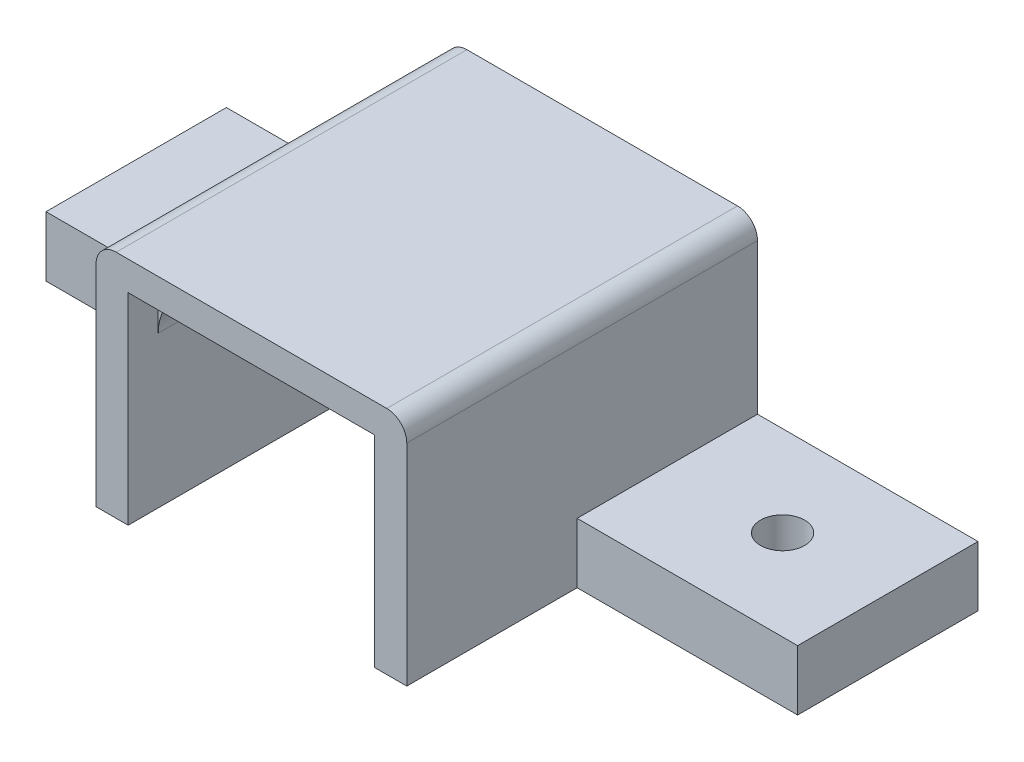
ISO-10303-21;
HEADER;
FILE_DESCRIPTION(('STEP AP214'),'2;1');
FILE_NAME('part.step','',(''),(''),'','','');
FILE_SCHEMA(('AUTOMOTIVE_DESIGN { 1 0 10303 214 1 1 1 1 }'));
ENDSEC;
DATA;
#1=APPLICATION_CONTEXT('core data for automotive mechanical design processes');
#2=APPLICATION_PROTOCOL_DEFINITION('international standard','automotive_design',2000,#1);
#3=PRODUCT_CONTEXT('',#1,'mechanical');
#4=PRODUCT('Part','Part','',(#3));
#5=PRODUCT_RELATED_PRODUCT_CATEGORY('part','',(#4));
#6=PRODUCT_DEFINITION_FORMATION('','',#4);
#7=PRODUCT_DEFINITION_CONTEXT('part definition',#1,'design');
#8=PRODUCT_DEFINITION('design','',#6,#7);
#9=PRODUCT_DEFINITION_SHAPE('','',#8);
#10=(LENGTH_UNIT() NAMED_UNIT(*) SI_UNIT(.MILLI.,.METRE.));
#11=(NAMED_UNIT(*) PLANE_ANGLE_UNIT() SI_UNIT($,.RADIAN.));
#12=(NAMED_UNIT(*) SI_UNIT($,.STERADIAN.) SOLID_ANGLE_UNIT());
#13=UNCERTAINTY_MEASURE_WITH_UNIT(LENGTH_MEASURE(1.E-05),#10,'distance_accuracy_value','');
#14=(GEOMETRIC_REPRESENTATION_CONTEXT(3) GLOBAL_UNCERTAINTY_ASSIGNED_CONTEXT((#13)) GLOBAL_UNIT_ASSIGNED_CONTEXT((#10,
#11,#12)) REPRESENTATION_CONTEXT('',''));
#15=CARTESIAN_POINT('',(0.,0.,0.));
#16=DIRECTION('',(0.,0.,1.));
#17=DIRECTION('',(1.,0.,0.));
#18=AXIS2_PLACEMENT_3D('',#15,#16,#17);
#19=CARTESIAN_POINT('',(0.,10.05,-8.75));
#20=DIRECTION('',(0.,-1.,0.));
#21=DIRECTION('',(0.,0.,-1.));
#22=AXIS2_PLACEMENT_3D('',#19,#20,#21);
#23=PLANE('',#22);
#24=DIRECTION('',(0.,0.,1.));
#25=VECTOR('',#24,1.);
#26=CARTESIAN_POINT('',(6.15,10.05,0.));
#27=LINE('',#26,#25);
#28=CARTESIAN_POINT('',(6.15,10.05,-0.750000000000001));
#29=VERTEX_POINT('',#28);
#30=CARTESIAN_POINT('',(6.15,10.05,3.25));
#31=VERTEX_POINT('',#30);
#32=EDGE_CURVE('E248',#29,#31,#27,.T.);
#33=ORIENTED_EDGE('',*,*,#32,.T.);
#34=DIRECTION('',(1.,0.,0.));
#35=VECTOR('',#34,1.);
#36=CARTESIAN_POINT('',(0.,10.05,3.25));
#37=LINE('',#36,#35);
#38=CARTESIAN_POINT('',(4.15,10.05,3.25));
#39=VERTEX_POINT('',#38);
#40=EDGE_CURVE('E234',#39,#31,#37,.T.);
#41=ORIENTED_EDGE('',*,*,#40,.F.);
#42=DIRECTION('',(0.,0.,1.));
#43=VECTOR('',#42,1.);
#44=CARTESIAN_POINT('',(4.15,10.05,-8.75));
#45=LINE('',#44,#43);
#46=CARTESIAN_POINT('',(4.15,10.05,7.25));
#47=VERTEX_POINT('',#46);
#48=EDGE_CURVE('E394',#39,#47,#45,.T.);
#49=ORIENTED_EDGE('',*,*,#48,.T.);
#50=DIRECTION('',(1.,0.,0.));
#51=VECTOR('',#50,1.);
#52=CARTESIAN_POINT('',(0.,10.05,7.25));
#53=LINE('',#52,#51);
#54=CARTESIAN_POINT('',(6.15,10.05,7.25));
#55=VERTEX_POINT('',#54);
#56=EDGE_CURVE('E237',#47,#55,#53,.T.);
#57=ORIENTED_EDGE('',*,*,#56,.T.);
#58=DIRECTION('',(0.,0.,1.));
#59=VECTOR('',#58,1.);
#60=CARTESIAN_POINT('',(6.15,10.05,0.));
#61=LINE('',#60,#59);
#62=CARTESIAN_POINT('',(6.15,10.05,8.75));
#63=VERTEX_POINT('',#62);
#64=EDGE_CURVE('E240',#55,#63,#61,.T.);
#65=ORIENTED_EDGE('',*,*,#64,.T.);
#66=DIRECTION('',(1.,0.,0.));
#67=VECTOR('',#66,1.);
#68=CARTESIAN_POINT('',(0.,10.05,8.75));
#69=LINE('',#68,#67);
#70=CARTESIAN_POINT('',(-6.15,10.05,8.75));
#71=VERTEX_POINT('',#70);
#72=EDGE_CURVE('E357',#71,#63,#69,.T.);
#73=ORIENTED_EDGE('',*,*,#72,.F.);
#74=DIRECTION('',(0.,0.,-1.));
#75=VECTOR('',#74,1.);
#76=CARTESIAN_POINT('',(-6.15,10.05,0.));
#77=LINE('',#76,#75);
#78=CARTESIAN_POINT('',(-6.15,10.05,7.25));
#79=VERTEX_POINT('',#78);
#80=EDGE_CURVE('E243',#71,#79,#77,.T.);
#81=ORIENTED_EDGE('',*,*,#80,.T.);
#82=DIRECTION('',(-1.,0.,0.));
#83=VECTOR('',#82,1.);
#84=CARTESIAN_POINT('',(-6.15,10.05,7.25));
#85=LINE('',#84,#83);
#86=CARTESIAN_POINT('',(-3.65,10.05,7.25));
#87=VERTEX_POINT('',#86);
#88=EDGE_CURVE('E214',#87,#79,#85,.T.);
#89=ORIENTED_EDGE('',*,*,#88,.F.);
#90=DIRECTION('',(0.,0.,1.));
#91=VECTOR('',#90,1.);
#92=CARTESIAN_POINT('',(-3.65,10.05,7.25));
#93=LINE('',#92,#91);
#94=CARTESIAN_POINT('',(-3.65,10.05,3.25));
#95=VERTEX_POINT('',#94);
#96=EDGE_CURVE('E503',#95,#87,#93,.T.);
#97=ORIENTED_EDGE('',*,*,#96,.F.);
#98=DIRECTION('',(1.,0.,0.));
#99=VECTOR('',#98,1.);
#100=CARTESIAN_POINT('',(-6.15,10.05,3.25));
#101=LINE('',#100,#99);
#102=CARTESIAN_POINT('',(-6.15,10.05,3.25));
#103=VERTEX_POINT('',#102);
#104=EDGE_CURVE('E220',#103,#95,#101,.T.);
#105=ORIENTED_EDGE('',*,*,#104,.F.);
#106=CARTESIAN_POINT('',(-6.15,10.05,-0.750000000000001));
#107=VERTEX_POINT('',#106);
#108=EDGE_CURVE('E226',#103,#107,#77,.T.);
#109=ORIENTED_EDGE('',*,*,#108,.T.);
#110=DIRECTION('',(1.,0.,0.));
#111=VECTOR('',#110,1.);
#112=CARTESIAN_POINT('',(0.,10.05,-0.750000000000001));
#113=LINE('',#112,#111);
#114=CARTESIAN_POINT('',(-4.15,10.05,-0.750000000000001));
#115=VERTEX_POINT('',#114);
#116=EDGE_CURVE('E58',#107,#115,#113,.T.);
#117=ORIENTED_EDGE('',*,*,#116,.T.);
#118=DIRECTION('',(0.,0.,1.));
#119=VECTOR('',#118,1.);
#120=CARTESIAN_POINT('',(-4.15,10.05,-8.75));
#121=LINE('',#120,#119);
#122=CARTESIAN_POINT('',(-4.15,10.05,-8.75));
#123=VERTEX_POINT('',#122);
#124=EDGE_CURVE('E398',#115,#123,#121,.F.);
#125=ORIENTED_EDGE('',*,*,#124,.T.);
#126=DIRECTION('',(1.,0.,0.));
#127=VECTOR('',#126,1.);
#128=CARTESIAN_POINT('',(0.,10.05,-8.75));
#129=LINE('',#128,#127);
#130=CARTESIAN_POINT('',(4.15,10.05,-8.75));
#131=VERTEX_POINT('',#130);
#132=EDGE_CURVE('E356',#123,#131,#129,.T.);
#133=ORIENTED_EDGE('',*,*,#132,.T.);
#134=CARTESIAN_POINT('',(4.15,10.05,-0.750000000000001));
#135=VERTEX_POINT('',#134);
#136=EDGE_CURVE('E395',#131,#135,#45,.T.);
#137=ORIENTED_EDGE('',*,*,#136,.T.);
#138=EDGE_CURVE('E246',#135,#29,#113,.T.);
#139=ORIENTED_EDGE('',*,*,#138,.T.);
#140=EDGE_LOOP('',(#33,#41,#49,#57,#65,#73,#81,#89,#97,#105,#109,#117,#125,#133,#137,#139));
#141=FACE_BOUND('',#140,.T.);
#142=ADVANCED_FACE('F35',(#141),#23,.T.);
#143=CARTESIAN_POINT('',(-6.15,0.,-8.75));
#144=DIRECTION('',(-1.,0.,0.));
#145=DIRECTION('',(0.,1.,0.));
#146=AXIS2_PLACEMENT_3D('',#143,#144,#145);
#147=PLANE('',#146);
#148=DIRECTION('',(0.,1.,0.));
#149=VECTOR('',#148,1.);
#150=CARTESIAN_POINT('',(-6.15,7.55,3.25));
#151=LINE('',#150,#149);
#152=CARTESIAN_POINT('',(-6.15,7.55,3.25));
#153=VERTEX_POINT('',#152);
#154=EDGE_CURVE('E218',#153,#103,#151,.T.);
#155=ORIENTED_EDGE('',*,*,#154,.F.);
#156=DIRECTION('',(0.,0.,-1.));
#157=VECTOR('',#156,1.);
#158=CARTESIAN_POINT('',(-6.15,7.55,7.25));
#159=LINE('',#158,#157);
#160=CARTESIAN_POINT('',(-6.15,7.55,7.25));
#161=VERTEX_POINT('',#160);
#162=EDGE_CURVE('E205',#161,#153,#159,.T.);
#163=ORIENTED_EDGE('',*,*,#162,.F.);
#164=DIRECTION('',(0.,1.,0.));
#165=VECTOR('',#164,1.);
#166=CARTESIAN_POINT('',(-6.15,7.55,7.25));
#167=LINE('',#166,#165);
#168=EDGE_CURVE('E213',#161,#79,#167,.T.);
#169=ORIENTED_EDGE('',*,*,#168,.T.);
#170=ORIENTED_EDGE('',*,*,#80,.F.);
#171=DIRECTION('',(0.,1.,0.));
#172=VECTOR('',#171,1.);
#173=CARTESIAN_POINT('',(-6.15,0.,8.75));
#174=LINE('',#173,#172);
#175=CARTESIAN_POINT('',(-6.15,0.,8.75));
#176=VERTEX_POINT('',#175);
#177=EDGE_CURVE('E321',#176,#71,#174,.T.);
#178=ORIENTED_EDGE('',*,*,#177,.F.);
#179=DIRECTION('',(0.,0.,1.));
#180=VECTOR('',#179,1.);
#181=CARTESIAN_POINT('',(-6.15,0.,-8.75));
#182=LINE('',#181,#180);
#183=CARTESIAN_POINT('',(-6.15,0.,-8.75));
#184=VERTEX_POINT('',#183);
#185=EDGE_CURVE('E326',#184,#176,#182,.T.);
#186=ORIENTED_EDGE('',*,*,#185,.F.);
#187=DIRECTION('',(0.,1.,0.));
#188=VECTOR('',#187,1.);
#189=CARTESIAN_POINT('',(-6.15,0.,-8.75));
#190=LINE('',#189,#188);
#191=CARTESIAN_POINT('',(-6.15,8.05,-8.75));
#192=VERTEX_POINT('',#191);
#193=EDGE_CURVE('E323',#184,#192,#190,.T.);
#194=ORIENTED_EDGE('',*,*,#193,.T.);
#195=DIRECTION('',(0.,0.,1.));
#196=VECTOR('',#195,1.);
#197=CARTESIAN_POINT('',(-6.15,8.05,-8.75));
#198=LINE('',#197,#196);
#199=CARTESIAN_POINT('',(-6.15,8.05,-0.750000000000001));
#200=VERTEX_POINT('',#199);
#201=EDGE_CURVE('E391',#192,#200,#198,.T.);
#202=ORIENTED_EDGE('',*,*,#201,.T.);
#203=DIRECTION('',(0.,-1.,0.));
#204=VECTOR('',#203,1.);
#205=CARTESIAN_POINT('',(-6.15,25.5915571935376,-0.750000000000001));
#206=LINE('',#205,#204);
#207=EDGE_CURVE('E253',#107,#200,#206,.T.);
#208=ORIENTED_EDGE('',*,*,#207,.F.);
#209=ORIENTED_EDGE('',*,*,#108,.F.);
#210=EDGE_LOOP('',(#155,#163,#169,#170,#178,#186,#194,#202,#208,#209));
#211=FACE_BOUND('',#210,.T.);
#212=ADVANCED_FACE('F224',(#211),#147,.F.);
#213=CARTESIAN_POINT('',(-7.75,11.5,8.75));
#214=DIRECTION('',(0.,0.,-1.));
#215=DIRECTION('',(-1.,0.,0.));
#216=AXIS2_PLACEMENT_3D('',#213,#214,#215);
#217=PLANE('',#216);
#218=ORIENTED_EDGE('',*,*,#72,.T.);
#219=DIRECTION('',(0.,1.,0.));
#220=VECTOR('',#219,1.);
#221=CARTESIAN_POINT('',(6.15,0.,8.75));
#222=LINE('',#221,#220);
#223=CARTESIAN_POINT('',(6.15,0.,8.75));
#224=VERTEX_POINT('',#223);
#225=EDGE_CURVE('E352',#224,#63,#222,.T.);
#226=ORIENTED_EDGE('',*,*,#225,.F.);
#227=DIRECTION('',(1.,0.,0.));
#228=VECTOR('',#227,1.);
#229=CARTESIAN_POINT('',(-7.75,0.,8.75));
#230=LINE('',#229,#228);
#231=CARTESIAN_POINT('',(7.75,0.,8.75));
#232=VERTEX_POINT('',#231);
#233=EDGE_CURVE('E369',#224,#232,#230,.T.);
#234=ORIENTED_EDGE('',*,*,#233,.T.);
#235=DIRECTION('',(0.,-1.,0.));
#236=VECTOR('',#235,1.);
#237=CARTESIAN_POINT('',(7.75,11.5,8.75));
#238=LINE('',#237,#236);
#239=CARTESIAN_POINT('',(7.75,10.5,8.75));
#240=VERTEX_POINT('',#239);
#241=EDGE_CURVE('E377',#240,#232,#238,.T.);
#242=ORIENTED_EDGE('',*,*,#241,.F.);
#243=CARTESIAN_POINT('',(6.75,10.5,8.75));
#244=DIRECTION('',(0.,0.,-1.));
#245=DIRECTION('',(-1.,0.,0.));
#246=AXIS2_PLACEMENT_3D('',#243,#244,#245);
#247=CIRCLE('',#246,1.);
#248=CARTESIAN_POINT('',(6.75,11.5,8.75));
#249=VERTEX_POINT('',#248);
#250=EDGE_CURVE('E388',#240,#249,#247,.F.);
#251=ORIENTED_EDGE('',*,*,#250,.T.);
#252=DIRECTION('',(1.,0.,0.));
#253=VECTOR('',#252,1.);
#254=CARTESIAN_POINT('',(-7.75,11.5,8.75));
#255=LINE('',#254,#253);
#256=CARTESIAN_POINT('',(-6.75,11.5,8.75));
#257=VERTEX_POINT('',#256);
#258=EDGE_CURVE('E368',#257,#249,#255,.T.);
#259=ORIENTED_EDGE('',*,*,#258,.F.);
#260=CARTESIAN_POINT('',(-6.75,10.5,8.75));
#261=DIRECTION('',(0.,0.,1.));
#262=DIRECTION('',(1.,0.,0.));
#263=AXIS2_PLACEMENT_3D('',#260,#261,#262);
#264=CIRCLE('',#263,1.);
#265=CARTESIAN_POINT('',(-7.75,10.5,8.75));
#266=VERTEX_POINT('',#265);
#267=EDGE_CURVE('E333',#266,#257,#264,.F.);
#268=ORIENTED_EDGE('',*,*,#267,.F.);
#269=DIRECTION('',(0.,-1.,0.));
#270=VECTOR('',#269,1.);
#271=CARTESIAN_POINT('',(-7.75,11.5,8.75));
#272=LINE('',#271,#270);
#273=CARTESIAN_POINT('',(-7.75,0.,8.75));
#274=VERTEX_POINT('',#273);
#275=EDGE_CURVE('E330',#266,#274,#272,.T.);
#276=ORIENTED_EDGE('',*,*,#275,.T.);
#277=DIRECTION('',(-1.,0.,0.));
#278=VECTOR('',#277,1.);
#279=CARTESIAN_POINT('',(7.75,0.,8.75));
#280=LINE('',#279,#278);
#281=EDGE_CURVE('E328',#176,#274,#280,.T.);
#282=ORIENTED_EDGE('',*,*,#281,.F.);
#283=ORIENTED_EDGE('',*,*,#177,.T.);
#284=EDGE_LOOP('',(#218,#226,#234,#242,#251,#259,#268,#276,#282,#283));
#285=FACE_BOUND('',#284,.T.);
#286=ADVANCED_FACE('F477',(#285),#217,.F.);
#287=CARTESIAN_POINT('',(-4.15,8.05,-8.75));
#288=DIRECTION('',(0.,0.,1.));
#289=DIRECTION('',(1.,0.,0.));
#290=AXIS2_PLACEMENT_3D('',#287,#288,#289);
#291=CYLINDRICAL_SURFACE('',#290,2.);
#292=CARTESIAN_POINT('',(-4.15,8.05,-0.750000000000001));
#293=DIRECTION('',(0.,0.,1.));
#294=DIRECTION('',(1.,0.,0.));
#295=AXIS2_PLACEMENT_3D('',#292,#293,#294);
#296=CIRCLE('',#295,2.);
#297=EDGE_CURVE('E250',#200,#115,#296,.F.);
#298=ORIENTED_EDGE('',*,*,#297,.F.);
#299=ORIENTED_EDGE('',*,*,#201,.F.);
#300=CARTESIAN_POINT('',(-4.15,8.05,-8.75));
#301=DIRECTION('',(0.,0.,-1.));
#302=DIRECTION('',(-1.,0.,0.));
#303=AXIS2_PLACEMENT_3D('',#300,#301,#302);
#304=CIRCLE('',#303,2.);
#305=EDGE_CURVE('E403',#123,#192,#304,.F.);
#306=ORIENTED_EDGE('',*,*,#305,.F.);
#307=ORIENTED_EDGE('',*,*,#124,.F.);
#308=EDGE_LOOP('',(#298,#299,#306,#307));
#309=FACE_BOUND('',#308,.T.);
#310=ADVANCED_FACE('F443',(#309),#291,.F.);
#311=CARTESIAN_POINT('',(4.15,8.05,-8.75));
#312=DIRECTION('',(0.,0.,1.));
#313=DIRECTION('',(1.,0.,0.));
#314=AXIS2_PLACEMENT_3D('',#311,#312,#313);
#315=CYLINDRICAL_SURFACE('',#314,2.);
#316=CARTESIAN_POINT('',(4.15,8.05,-0.750000000000001));
#317=DIRECTION('',(0.,0.,1.));
#318=DIRECTION('',(1.,0.,0.));
#319=AXIS2_PLACEMENT_3D('',#316,#317,#318);
#320=CIRCLE('',#319,2.);
#321=CARTESIAN_POINT('',(6.15,8.05,-0.750000000000001));
#322=VERTEX_POINT('',#321);
#323=EDGE_CURVE('E11',#135,#322,#320,.F.);
#324=ORIENTED_EDGE('',*,*,#323,.F.);
#325=ORIENTED_EDGE('',*,*,#136,.F.);
#326=CARTESIAN_POINT('',(4.15,8.05,-8.75));
#327=DIRECTION('',(0.,0.,-1.));
#328=DIRECTION('',(-1.,0.,0.));
#329=AXIS2_PLACEMENT_3D('',#326,#327,#328);
#330=CIRCLE('',#329,2.);
#331=CARTESIAN_POINT('',(6.15,8.05,-8.75));
#332=VERTEX_POINT('',#331);
#333=EDGE_CURVE('E405',#332,#131,#330,.F.);
#334=ORIENTED_EDGE('',*,*,#333,.F.);
#335=DIRECTION('',(0.,0.,1.));
#336=VECTOR('',#335,1.);
#337=CARTESIAN_POINT('',(6.15,8.05,-8.75));
#338=LINE('',#337,#336);
#339=EDGE_CURVE('E400',#322,#332,#338,.F.);
#340=ORIENTED_EDGE('',*,*,#339,.F.);
#341=EDGE_LOOP('',(#324,#325,#334,#340));
#342=FACE_BOUND('',#341,.T.);
#343=ADVANCED_FACE('F37',(#342),#315,.F.);
#344=CARTESIAN_POINT('',(4.15,8.05,7.25));
#345=DIRECTION('',(0.,0.,1.));
#346=DIRECTION('',(1.,0.,0.));
#347=AXIS2_PLACEMENT_3D('',#344,#345,#346);
#348=CIRCLE('',#347,2.);
#349=CARTESIAN_POINT('',(6.15,8.05,7.25));
#350=VERTEX_POINT('',#349);
#351=EDGE_CURVE('E43',#47,#350,#348,.F.);
#352=ORIENTED_EDGE('',*,*,#351,.F.);
#353=ORIENTED_EDGE('',*,*,#48,.F.);
#354=CARTESIAN_POINT('',(4.15,8.05,3.25));
#355=DIRECTION('',(0.,0.,1.));
#356=DIRECTION('',(1.,0.,0.));
#357=AXIS2_PLACEMENT_3D('',#354,#355,#356);
#358=CIRCLE('',#357,2.);
#359=CARTESIAN_POINT('',(6.15,8.05,3.25));
#360=VERTEX_POINT('',#359);
#361=EDGE_CURVE('E407',#39,#360,#358,.F.);
#362=ORIENTED_EDGE('',*,*,#361,.T.);
#363=EDGE_CURVE('E402',#350,#360,#338,.F.);
#364=ORIENTED_EDGE('',*,*,#363,.F.);
#365=EDGE_LOOP('',(#352,#353,#362,#364));
#366=FACE_BOUND('',#365,.T.);
#367=ADVANCED_FACE('F422',(#366),#315,.F.);
#368=CARTESIAN_POINT('',(7.75,11.5,8.75));
#369=DIRECTION('',(-1.,0.,0.));
#370=DIRECTION('',(0.,0.,1.));
#371=AXIS2_PLACEMENT_3D('',#368,#369,#370);
#372=PLANE('',#371);
#373=DIRECTION('',(0.,0.,1.));
#374=VECTOR('',#373,1.);
#375=CARTESIAN_POINT('',(7.75,3.,-8.75));
#376=LINE('',#375,#374);
#377=CARTESIAN_POINT('',(7.75,3.,-8.75));
#378=VERTEX_POINT('',#377);
#379=CARTESIAN_POINT('',(7.75,3.,0.249999999999999));
#380=VERTEX_POINT('',#379);
#381=EDGE_CURVE('E262',#378,#380,#376,.T.);
#382=ORIENTED_EDGE('',*,*,#381,.F.);
#383=DIRECTION('',(0.,-1.,0.));
#384=VECTOR('',#383,1.);
#385=CARTESIAN_POINT('',(7.75,11.5,-8.75));
#386=LINE('',#385,#384);
#387=CARTESIAN_POINT('',(7.75,10.5,-8.75));
#388=VERTEX_POINT('',#387);
#389=EDGE_CURVE('E371',#388,#378,#386,.T.);
#390=ORIENTED_EDGE('',*,*,#389,.F.);
#391=DIRECTION('',(0.,0.,-1.));
#392=VECTOR('',#391,1.);
#393=CARTESIAN_POINT('',(7.75,10.5,8.75));
#394=LINE('',#393,#392);
#395=EDGE_CURVE('E386',#388,#240,#394,.F.);
#396=ORIENTED_EDGE('',*,*,#395,.T.);
#397=ORIENTED_EDGE('',*,*,#241,.T.);
#398=DIRECTION('',(0.,0.,-1.));
#399=VECTOR('',#398,1.);
#400=CARTESIAN_POINT('',(7.75,0.,8.75));
#401=LINE('',#400,#399);
#402=CARTESIAN_POINT('',(7.75,0.,0.249999999999999));
#403=VERTEX_POINT('',#402);
#404=EDGE_CURVE('E373',#232,#403,#401,.T.);
#405=ORIENTED_EDGE('',*,*,#404,.T.);
#406=DIRECTION('',(0.,-1.,0.));
#407=VECTOR('',#406,1.);
#408=CARTESIAN_POINT('',(7.75,0.,0.249999999999999));
#409=LINE('',#408,#407);
#410=EDGE_CURVE('E269',#380,#403,#409,.T.);
#411=ORIENTED_EDGE('',*,*,#410,.F.);
#412=EDGE_LOOP('',(#382,#390,#396,#397,#405,#411));
#413=FACE_BOUND('',#412,.T.);
#414=ADVANCED_FACE('F482',(#413),#372,.F.);
#415=CARTESIAN_POINT('',(-7.75,11.5,8.75));
#416=DIRECTION('',(1.,0.,0.));
#417=DIRECTION('',(0.,0.,1.));
#418=AXIS2_PLACEMENT_3D('',#415,#416,#417);
#419=PLANE('',#418);
#420=DIRECTION('',(0.,0.,1.));
#421=VECTOR('',#420,1.);
#422=CARTESIAN_POINT('',(-7.75,3.,-8.75));
#423=LINE('',#422,#421);
#424=CARTESIAN_POINT('',(-7.75,3.,-8.75));
#425=VERTEX_POINT('',#424);
#426=CARTESIAN_POINT('',(-7.75,3.,0.249999999999999));
#427=VERTEX_POINT('',#426);
#428=EDGE_CURVE('E298',#425,#427,#423,.T.);
#429=ORIENTED_EDGE('',*,*,#428,.T.);
#430=DIRECTION('',(0.,-1.,0.));
#431=VECTOR('',#430,1.);
#432=CARTESIAN_POINT('',(-7.75,0.,0.249999999999999));
#433=LINE('',#432,#431);
#434=CARTESIAN_POINT('',(-7.75,0.,0.249999999999999));
#435=VERTEX_POINT('',#434);
#436=EDGE_CURVE('E307',#427,#435,#433,.T.);
#437=ORIENTED_EDGE('',*,*,#436,.T.);
#438=DIRECTION('',(0.,0.,-1.));
#439=VECTOR('',#438,1.);
#440=CARTESIAN_POINT('',(-7.75,0.,8.75));
#441=LINE('',#440,#439);
#442=EDGE_CURVE('E349',#274,#435,#441,.T.);
#443=ORIENTED_EDGE('',*,*,#442,.F.);
#444=ORIENTED_EDGE('',*,*,#275,.F.);
#445=DIRECTION('',(0.,0.,-1.));
#446=VECTOR('',#445,1.);
#447=CARTESIAN_POINT('',(-7.75,10.5,8.75));
#448=LINE('',#447,#446);
#449=CARTESIAN_POINT('',(-7.75,10.5,-8.75));
#450=VERTEX_POINT('',#449);
#451=EDGE_CURVE('E336',#450,#266,#448,.F.);
#452=ORIENTED_EDGE('',*,*,#451,.F.);
#453=DIRECTION('',(0.,-1.,0.));
#454=VECTOR('',#453,1.);
#455=CARTESIAN_POINT('',(-7.75,11.5,-8.75));
#456=LINE('',#455,#454);
#457=EDGE_CURVE('E344',#450,#425,#456,.T.);
#458=ORIENTED_EDGE('',*,*,#457,.T.);
#459=EDGE_LOOP('',(#429,#437,#443,#444,#452,#458));
#460=FACE_BOUND('',#459,.T.);
#461=ADVANCED_FACE('F460',(#460),#419,.F.);
#462=CARTESIAN_POINT('',(-7.75,11.5,-8.75));
#463=DIRECTION('',(0.,0.,-1.));
#464=DIRECTION('',(-1.,0.,0.));
#465=AXIS2_PLACEMENT_3D('',#462,#463,#464);
#466=PLANE('',#465);
#467=ORIENTED_EDGE('',*,*,#132,.F.);
#468=ORIENTED_EDGE('',*,*,#305,.T.);
#469=ORIENTED_EDGE('',*,*,#193,.F.);
#470=DIRECTION('',(-1.,0.,0.));
#471=VECTOR('',#470,1.);
#472=CARTESIAN_POINT('',(7.75,0.,-8.75));
#473=LINE('',#472,#471);
#474=CARTESIAN_POINT('',(-18.75,0.,-8.75));
#475=VERTEX_POINT('',#474);
#476=EDGE_CURVE('E347',#184,#475,#473,.T.);
#477=ORIENTED_EDGE('',*,*,#476,.T.);
#478=DIRECTION('',(0.,1.,0.));
#479=VECTOR('',#478,1.);
#480=CARTESIAN_POINT('',(-18.75,0.,-8.75));
#481=LINE('',#480,#479);
#482=CARTESIAN_POINT('',(-18.75,3.,-8.75));
#483=VERTEX_POINT('',#482);
#484=EDGE_CURVE('E292',#475,#483,#481,.T.);
#485=ORIENTED_EDGE('',*,*,#484,.T.);
#486=DIRECTION('',(1.,0.,0.));
#487=VECTOR('',#486,1.);
#488=CARTESIAN_POINT('',(-18.75,3.,-8.75));
#489=LINE('',#488,#487);
#490=EDGE_CURVE('E289',#483,#425,#489,.T.);
#491=ORIENTED_EDGE('',*,*,#490,.T.);
#492=ORIENTED_EDGE('',*,*,#457,.F.);
#493=CARTESIAN_POINT('',(-6.75,10.5,-8.75));
#494=DIRECTION('',(0.,0.,1.));
#495=DIRECTION('',(1.,0.,0.));
#496=AXIS2_PLACEMENT_3D('',#493,#494,#495);
#497=CIRCLE('',#496,1.);
#498=CARTESIAN_POINT('',(-6.75,11.5,-8.75));
#499=VERTEX_POINT('',#498);
#500=EDGE_CURVE('E339',#499,#450,#497,.T.);
#501=ORIENTED_EDGE('',*,*,#500,.F.);
#502=DIRECTION('',(1.,0.,0.));
#503=VECTOR('',#502,1.);
#504=CARTESIAN_POINT('',(-7.75,11.5,-8.75));
#505=LINE('',#504,#503);
#506=CARTESIAN_POINT('',(6.75,11.5,-8.75));
#507=VERTEX_POINT('',#506);
#508=EDGE_CURVE('E366',#499,#507,#505,.T.);
#509=ORIENTED_EDGE('',*,*,#508,.T.);
#510=CARTESIAN_POINT('',(6.75,10.5,-8.75));
#511=DIRECTION('',(0.,0.,-1.));
#512=DIRECTION('',(-1.,0.,0.));
#513=AXIS2_PLACEMENT_3D('',#510,#511,#512);
#514=CIRCLE('',#513,1.);
#515=EDGE_CURVE('E384',#507,#388,#514,.T.);
#516=ORIENTED_EDGE('',*,*,#515,.T.);
#517=ORIENTED_EDGE('',*,*,#389,.T.);
#518=DIRECTION('',(-1.,0.,0.));
#519=VECTOR('',#518,1.);
#520=CARTESIAN_POINT('',(18.75,3.,-8.75));
#521=LINE('',#520,#519);
#522=CARTESIAN_POINT('',(18.75,3.,-8.75));
#523=VERTEX_POINT('',#522);
#524=EDGE_CURVE('E286',#523,#378,#521,.T.);
#525=ORIENTED_EDGE('',*,*,#524,.F.);
#526=DIRECTION('',(0.,1.,0.));
#527=VECTOR('',#526,1.);
#528=CARTESIAN_POINT('',(18.75,0.,-8.75));
#529=LINE('',#528,#527);
#530=CARTESIAN_POINT('',(18.75,0.,-8.75));
#531=VERTEX_POINT('',#530);
#532=EDGE_CURVE('E265',#531,#523,#529,.T.);
#533=ORIENTED_EDGE('',*,*,#532,.F.);
#534=DIRECTION('',(1.,0.,0.));
#535=VECTOR('',#534,1.);
#536=CARTESIAN_POINT('',(-7.75,0.,-8.75));
#537=LINE('',#536,#535);
#538=CARTESIAN_POINT('',(6.15,0.,-8.75));
#539=VERTEX_POINT('',#538);
#540=EDGE_CURVE('E365',#539,#531,#537,.T.);
#541=ORIENTED_EDGE('',*,*,#540,.F.);
#542=DIRECTION('',(0.,1.,0.));
#543=VECTOR('',#542,1.);
#544=CARTESIAN_POINT('',(6.15,0.,-8.75));
#545=LINE('',#544,#543);
#546=EDGE_CURVE('E353',#539,#332,#545,.T.);
#547=ORIENTED_EDGE('',*,*,#546,.T.);
#548=ORIENTED_EDGE('',*,*,#333,.T.);
#549=EDGE_LOOP('',(#467,#468,#469,#477,#485,#491,#492,#501,#509,#516,#517,#525,#533,#541,#547,#548));
#550=FACE_BOUND('',#549,.T.);
#551=ADVANCED_FACE('F439',(#550),#466,.T.);
#552=CARTESIAN_POINT('',(0.,11.5,0.));
#553=DIRECTION('',(0.,-1.,0.));
#554=DIRECTION('',(0.,0.,-1.));
#555=AXIS2_PLACEMENT_3D('',#552,#553,#554);
#556=PLANE('',#555);
#557=ORIENTED_EDGE('',*,*,#508,.F.);
#558=DIRECTION('',(0.,0.,-1.));
#559=VECTOR('',#558,1.);
#560=CARTESIAN_POINT('',(-6.75,11.5,0.));
#561=LINE('',#560,#559);
#562=EDGE_CURVE('E341',#257,#499,#561,.T.);
#563=ORIENTED_EDGE('',*,*,#562,.F.);
#564=ORIENTED_EDGE('',*,*,#258,.T.);
#565=DIRECTION('',(0.,0.,-1.));
#566=VECTOR('',#565,1.);
#567=CARTESIAN_POINT('',(6.75,11.5,0.));
#568=LINE('',#567,#566);
#569=EDGE_CURVE('E379',#249,#507,#568,.T.);
#570=ORIENTED_EDGE('',*,*,#569,.T.);
#571=EDGE_LOOP('',(#557,#563,#564,#570));
#572=FACE_BOUND('',#571,.T.);
#573=ADVANCED_FACE('F474',(#572),#556,.F.);
#574=CARTESIAN_POINT('',(0.,0.,0.));
#575=DIRECTION('',(0.,-1.,0.));
#576=DIRECTION('',(0.,0.,-1.));
#577=AXIS2_PLACEMENT_3D('',#574,#575,#576);
#578=PLANE('',#577);
#579=DIRECTION('',(0.,0.,1.));
#580=VECTOR('',#579,1.);
#581=CARTESIAN_POINT('',(6.15,0.,-8.75));
#582=LINE('',#581,#580);
#583=EDGE_CURVE('E360',#539,#224,#582,.T.);
#584=ORIENTED_EDGE('',*,*,#583,.F.);
#585=ORIENTED_EDGE('',*,*,#540,.T.);
#586=DIRECTION('',(0.,0.,-1.));
#587=VECTOR('',#586,1.);
#588=CARTESIAN_POINT('',(18.75,0.,-8.75));
#589=LINE('',#588,#587);
#590=CARTESIAN_POINT('',(18.75,0.,0.249999999999999));
#591=VERTEX_POINT('',#590);
#592=EDGE_CURVE('E273',#591,#531,#589,.T.);
#593=ORIENTED_EDGE('',*,*,#592,.F.);
#594=DIRECTION('',(-1.,0.,0.));
#595=VECTOR('',#594,1.);
#596=CARTESIAN_POINT('',(18.75,0.,0.249999999999999));
#597=LINE('',#596,#595);
#598=EDGE_CURVE('E276',#591,#403,#597,.T.);
#599=ORIENTED_EDGE('',*,*,#598,.T.);
#600=ORIENTED_EDGE('',*,*,#404,.F.);
#601=ORIENTED_EDGE('',*,*,#233,.F.);
#602=EDGE_LOOP('',(#584,#585,#593,#599,#600,#601));
#603=FACE_BOUND('',#602,.T.);
#604=CARTESIAN_POINT('',(13.5,0.,-4.25));
#605=DIRECTION('',(0.,1.,0.));
#606=DIRECTION('',(0.,0.,1.));
#607=AXIS2_PLACEMENT_3D('',#604,#605,#606);
#608=CIRCLE('',#607,1.1);
#609=CARTESIAN_POINT('',(13.5,0.,-3.15));
#610=VERTEX_POINT('',#609);
#611=EDGE_CURVE('E259',#610,#610,#608,.T.);
#612=ORIENTED_EDGE('',*,*,#611,.T.);
#613=EDGE_LOOP('',(#612));
#614=FACE_BOUND('',#613,.T.);
#615=ADVANCED_FACE('F495',(#603,#614),#578,.T.);
#616=CARTESIAN_POINT('',(6.15,0.,-8.75));
#617=DIRECTION('',(1.,0.,0.));
#618=DIRECTION('',(0.,1.,0.));
#619=AXIS2_PLACEMENT_3D('',#616,#617,#618);
#620=PLANE('',#619);
#621=ORIENTED_EDGE('',*,*,#225,.T.);
#622=ORIENTED_EDGE('',*,*,#64,.F.);
#623=DIRECTION('',(0.,-1.,0.));
#624=VECTOR('',#623,1.);
#625=CARTESIAN_POINT('',(6.15,25.5915571935376,7.25));
#626=LINE('',#625,#624);
#627=EDGE_CURVE('E229',#55,#350,#626,.T.);
#628=ORIENTED_EDGE('',*,*,#627,.T.);
#629=ORIENTED_EDGE('',*,*,#363,.T.);
#630=DIRECTION('',(0.,-1.,0.));
#631=VECTOR('',#630,1.);
#632=CARTESIAN_POINT('',(6.15,25.5915571935376,3.25));
#633=LINE('',#632,#631);
#634=EDGE_CURVE('E227',#31,#360,#633,.T.);
#635=ORIENTED_EDGE('',*,*,#634,.F.);
#636=ORIENTED_EDGE('',*,*,#32,.F.);
#637=DIRECTION('',(0.,-1.,0.));
#638=VECTOR('',#637,1.);
#639=CARTESIAN_POINT('',(6.15,25.5915571935376,-0.750000000000001));
#640=LINE('',#639,#638);
#641=EDGE_CURVE('E238',#29,#322,#640,.T.);
#642=ORIENTED_EDGE('',*,*,#641,.T.);
#643=ORIENTED_EDGE('',*,*,#339,.T.);
#644=ORIENTED_EDGE('',*,*,#546,.F.);
#645=ORIENTED_EDGE('',*,*,#583,.T.);
#646=EDGE_LOOP('',(#621,#622,#628,#629,#635,#636,#642,#643,#644,#645));
#647=FACE_BOUND('',#646,.T.);
#648=ADVANCED_FACE('F420',(#647),#620,.F.);
#649=CARTESIAN_POINT('',(6.75,10.5,0.));
#650=DIRECTION('',(0.,0.,-1.));
#651=DIRECTION('',(-1.,0.,0.));
#652=AXIS2_PLACEMENT_3D('',#649,#650,#651);
#653=CYLINDRICAL_SURFACE('',#652,1.);
#654=ORIENTED_EDGE('',*,*,#250,.F.);
#655=ORIENTED_EDGE('',*,*,#395,.F.);
#656=ORIENTED_EDGE('',*,*,#515,.F.);
#657=ORIENTED_EDGE('',*,*,#569,.F.);
#658=EDGE_LOOP('',(#654,#655,#656,#657));
#659=FACE_BOUND('',#658,.T.);
#660=ADVANCED_FACE('F473',(#659),#653,.T.);
#661=CARTESIAN_POINT('',(0.,0.,0.));
#662=DIRECTION('',(0.,-1.,0.));
#663=DIRECTION('',(0.,0.,-1.));
#664=AXIS2_PLACEMENT_3D('',#661,#662,#663);
#665=PLANE('',#664);
#666=ORIENTED_EDGE('',*,*,#185,.T.);
#667=ORIENTED_EDGE('',*,*,#281,.T.);
#668=ORIENTED_EDGE('',*,*,#442,.T.);
#669=DIRECTION('',(1.,0.,0.));
#670=VECTOR('',#669,1.);
#671=CARTESIAN_POINT('',(-18.75,0.,0.25));
#672=LINE('',#671,#670);
#673=CARTESIAN_POINT('',(-18.75,0.,0.25));
#674=VERTEX_POINT('',#673);
#675=EDGE_CURVE('E310',#674,#435,#672,.T.);
#676=ORIENTED_EDGE('',*,*,#675,.F.);
#677=DIRECTION('',(0.,0.,-1.));
#678=VECTOR('',#677,1.);
#679=CARTESIAN_POINT('',(-18.75,0.,-8.75));
#680=LINE('',#679,#678);
#681=EDGE_CURVE('E318',#674,#475,#680,.T.);
#682=ORIENTED_EDGE('',*,*,#681,.T.);
#683=ORIENTED_EDGE('',*,*,#476,.F.);
#684=EDGE_LOOP('',(#666,#667,#668,#676,#682,#683));
#685=FACE_BOUND('',#684,.T.);
#686=CARTESIAN_POINT('',(-13.5,0.,-4.25));
#687=DIRECTION('',(0.,-1.,0.));
#688=DIRECTION('',(0.,0.,1.));
#689=AXIS2_PLACEMENT_3D('',#686,#687,#688);
#690=CIRCLE('',#689,1.1);
#691=CARTESIAN_POINT('',(-13.5,0.,-3.15));
#692=VERTEX_POINT('',#691);
#693=EDGE_CURVE('E315',#692,#692,#690,.T.);
#694=ORIENTED_EDGE('',*,*,#693,.F.);
#695=EDGE_LOOP('',(#694));
#696=FACE_BOUND('',#695,.T.);
#697=ADVANCED_FACE('F448',(#685,#696),#665,.T.);
#698=CARTESIAN_POINT('',(-6.75,10.5,0.));
#699=DIRECTION('',(0.,0.,-1.));
#700=DIRECTION('',(1.,0.,0.));
#701=AXIS2_PLACEMENT_3D('',#698,#699,#700);
#702=CYLINDRICAL_SURFACE('',#701,1.);
#703=ORIENTED_EDGE('',*,*,#267,.T.);
#704=ORIENTED_EDGE('',*,*,#562,.T.);
#705=ORIENTED_EDGE('',*,*,#500,.T.);
#706=ORIENTED_EDGE('',*,*,#451,.T.);
#707=EDGE_LOOP('',(#703,#704,#705,#706));
#708=FACE_BOUND('',#707,.T.);
#709=ADVANCED_FACE('F464',(#708),#702,.T.);
#710=CARTESIAN_POINT('',(-18.75,3.,-8.75));
#711=DIRECTION('',(0.,-1.,0.));
#712=DIRECTION('',(0.,0.,-1.));
#713=AXIS2_PLACEMENT_3D('',#710,#711,#712);
#714=PLANE('',#713);
#715=CARTESIAN_POINT('',(-13.5,3.,-4.25));
#716=DIRECTION('',(0.,-1.,0.));
#717=DIRECTION('',(0.,0.,1.));
#718=AXIS2_PLACEMENT_3D('',#715,#716,#717);
#719=CIRCLE('',#718,1.1);
#720=CARTESIAN_POINT('',(-13.5,3.,-3.15));
#721=VERTEX_POINT('',#720);
#722=EDGE_CURVE('E295',#721,#721,#719,.T.);
#723=ORIENTED_EDGE('',*,*,#722,.T.);
#724=EDGE_LOOP('',(#723));
#725=FACE_BOUND('',#724,.T.);
#726=ORIENTED_EDGE('',*,*,#428,.F.);
#727=ORIENTED_EDGE('',*,*,#490,.F.);
#728=DIRECTION('',(0.,0.,1.));
#729=VECTOR('',#728,1.);
#730=CARTESIAN_POINT('',(-18.75,3.,-8.75));
#731=LINE('',#730,#729);
#732=CARTESIAN_POINT('',(-18.75,3.,0.25));
#733=VERTEX_POINT('',#732);
#734=EDGE_CURVE('E304',#483,#733,#731,.T.);
#735=ORIENTED_EDGE('',*,*,#734,.T.);
#736=DIRECTION('',(1.,0.,0.));
#737=VECTOR('',#736,1.);
#738=CARTESIAN_POINT('',(-18.75,3.,0.25));
#739=LINE('',#738,#737);
#740=EDGE_CURVE('E301',#733,#427,#739,.T.);
#741=ORIENTED_EDGE('',*,*,#740,.T.);
#742=EDGE_LOOP('',(#726,#727,#735,#741));
#743=FACE_BOUND('',#742,.T.);
#744=ADVANCED_FACE('F594',(#725,#743),#714,.F.);
#745=CARTESIAN_POINT('',(-18.75,0.,0.25));
#746=DIRECTION('',(0.,0.,-1.));
#747=DIRECTION('',(1.,0.,0.));
#748=AXIS2_PLACEMENT_3D('',#745,#746,#747);
#749=PLANE('',#748);
#750=ORIENTED_EDGE('',*,*,#436,.F.);
#751=ORIENTED_EDGE('',*,*,#740,.F.);
#752=DIRECTION('',(0.,-1.,0.));
#753=VECTOR('',#752,1.);
#754=CARTESIAN_POINT('',(-18.75,0.,0.25));
#755=LINE('',#754,#753);
#756=EDGE_CURVE('E312',#733,#674,#755,.T.);
#757=ORIENTED_EDGE('',*,*,#756,.T.);
#758=ORIENTED_EDGE('',*,*,#675,.T.);
#759=EDGE_LOOP('',(#750,#751,#757,#758));
#760=FACE_BOUND('',#759,.T.);
#761=ADVANCED_FACE('F602',(#760),#749,.F.);
#762=CARTESIAN_POINT('',(-18.75,0.,0.));
#763=DIRECTION('',(-1.,0.,0.));
#764=DIRECTION('',(0.,0.,-1.));
#765=AXIS2_PLACEMENT_3D('',#762,#763,#764);
#766=PLANE('',#765);
#767=ORIENTED_EDGE('',*,*,#484,.F.);
#768=ORIENTED_EDGE('',*,*,#681,.F.);
#769=ORIENTED_EDGE('',*,*,#756,.F.);
#770=ORIENTED_EDGE('',*,*,#734,.F.);
#771=EDGE_LOOP('',(#767,#768,#769,#770));
#772=FACE_BOUND('',#771,.T.);
#773=ADVANCED_FACE('F453',(#772),#766,.T.);
#774=CARTESIAN_POINT('',(-13.5,0.,-4.25));
#775=DIRECTION('',(0.,1.,0.));
#776=DIRECTION('',(0.,0.,1.));
#777=AXIS2_PLACEMENT_3D('',#774,#775,#776);
#778=CYLINDRICAL_SURFACE('',#777,1.1);
#779=ORIENTED_EDGE('',*,*,#693,.T.);
#780=EDGE_LOOP('',(#779));
#781=FACE_BOUND('',#780,.T.);
#782=ORIENTED_EDGE('',*,*,#722,.F.);
#783=EDGE_LOOP('',(#782));
#784=FACE_BOUND('',#783,.T.);
#785=ADVANCED_FACE('F620',(#781,#784),#778,.F.);
#786=CARTESIAN_POINT('',(18.75,3.,-8.75));
#787=DIRECTION('',(0.,-1.,0.));
#788=DIRECTION('',(0.,0.,-1.));
#789=AXIS2_PLACEMENT_3D('',#786,#787,#788);
#790=PLANE('',#789);
#791=CARTESIAN_POINT('',(13.5,3.,-4.25));
#792=DIRECTION('',(0.,1.,0.));
#793=DIRECTION('',(0.,0.,1.));
#794=AXIS2_PLACEMENT_3D('',#791,#792,#793);
#795=CIRCLE('',#794,1.1);
#796=CARTESIAN_POINT('',(13.5,3.,-3.15));
#797=VERTEX_POINT('',#796);
#798=EDGE_CURVE('E258',#797,#797,#795,.T.);
#799=ORIENTED_EDGE('',*,*,#798,.F.);
#800=EDGE_LOOP('',(#799));
#801=FACE_BOUND('',#800,.T.);
#802=ORIENTED_EDGE('',*,*,#381,.T.);
#803=DIRECTION('',(-1.,0.,0.));
#804=VECTOR('',#803,1.);
#805=CARTESIAN_POINT('',(18.75,3.,0.249999999999999));
#806=LINE('',#805,#804);
#807=CARTESIAN_POINT('',(18.75,3.,0.249999999999999));
#808=VERTEX_POINT('',#807);
#809=EDGE_CURVE('E283',#808,#380,#806,.T.);
#810=ORIENTED_EDGE('',*,*,#809,.F.);
#811=DIRECTION('',(0.,0.,1.));
#812=VECTOR('',#811,1.);
#813=CARTESIAN_POINT('',(18.75,3.,-8.75));
#814=LINE('',#813,#812);
#815=EDGE_CURVE('E268',#523,#808,#814,.T.);
#816=ORIENTED_EDGE('',*,*,#815,.F.);
#817=ORIENTED_EDGE('',*,*,#524,.T.);
#818=EDGE_LOOP('',(#802,#810,#816,#817));
#819=FACE_BOUND('',#818,.T.);
#820=ADVANCED_FACE('F486',(#801,#819),#790,.F.);
#821=CARTESIAN_POINT('',(18.75,0.,0.249999999999999));
#822=DIRECTION('',(0.,0.,-1.));
#823=DIRECTION('',(-1.,0.,0.));
#824=AXIS2_PLACEMENT_3D('',#821,#822,#823);
#825=PLANE('',#824);
#826=ORIENTED_EDGE('',*,*,#410,.T.);
#827=ORIENTED_EDGE('',*,*,#598,.F.);
#828=DIRECTION('',(0.,-1.,0.));
#829=VECTOR('',#828,1.);
#830=CARTESIAN_POINT('',(18.75,0.,0.249999999999999));
#831=LINE('',#830,#829);
#832=EDGE_CURVE('E271',#808,#591,#831,.T.);
#833=ORIENTED_EDGE('',*,*,#832,.F.);
#834=ORIENTED_EDGE('',*,*,#809,.T.);
#835=EDGE_LOOP('',(#826,#827,#833,#834));
#836=FACE_BOUND('',#835,.T.);
#837=ADVANCED_FACE('F637',(#836),#825,.F.);
#838=CARTESIAN_POINT('',(18.75,0.,0.));
#839=DIRECTION('',(1.,0.,0.));
#840=DIRECTION('',(0.,0.,-1.));
#841=AXIS2_PLACEMENT_3D('',#838,#839,#840);
#842=PLANE('',#841);
#843=ORIENTED_EDGE('',*,*,#532,.T.);
#844=ORIENTED_EDGE('',*,*,#815,.T.);
#845=ORIENTED_EDGE('',*,*,#832,.T.);
#846=ORIENTED_EDGE('',*,*,#592,.T.);
#847=EDGE_LOOP('',(#843,#844,#845,#846));
#848=FACE_BOUND('',#847,.T.);
#849=ADVANCED_FACE('F490',(#848),#842,.T.);
#850=CARTESIAN_POINT('',(13.5,0.,-4.25));
#851=DIRECTION('',(0.,1.,0.));
#852=DIRECTION('',(0.,0.,1.));
#853=AXIS2_PLACEMENT_3D('',#850,#851,#852);
#854=CYLINDRICAL_SURFACE('',#853,1.1);
#855=ORIENTED_EDGE('',*,*,#611,.F.);
#856=EDGE_LOOP('',(#855));
#857=FACE_BOUND('',#856,.T.);
#858=ORIENTED_EDGE('',*,*,#798,.T.);
#859=EDGE_LOOP('',(#858));
#860=FACE_BOUND('',#859,.T.);
#861=ADVANCED_FACE('F518',(#857,#860),#854,.F.);
#862=CARTESIAN_POINT('',(0.,25.5915571935376,-0.750000000000001));
#863=DIRECTION('',(0.,0.,1.));
#864=DIRECTION('',(1.,0.,0.));
#865=AXIS2_PLACEMENT_3D('',#862,#863,#864);
#866=PLANE('',#865);
#867=ORIENTED_EDGE('',*,*,#323,.T.);
#868=ORIENTED_EDGE('',*,*,#641,.F.);
#869=ORIENTED_EDGE('',*,*,#138,.F.);
#870=EDGE_LOOP('',(#867,#868,#869));
#871=FACE_BOUND('',#870,.T.);
#872=ADVANCED_FACE('F430',(#871),#866,.T.);
#873=CARTESIAN_POINT('',(0.,25.5915571935376,3.25));
#874=DIRECTION('',(0.,0.,1.));
#875=DIRECTION('',(1.,0.,0.));
#876=AXIS2_PLACEMENT_3D('',#873,#874,#875);
#877=PLANE('',#876);
#878=ORIENTED_EDGE('',*,*,#40,.T.);
#879=ORIENTED_EDGE('',*,*,#634,.T.);
#880=ORIENTED_EDGE('',*,*,#361,.F.);
#881=EDGE_LOOP('',(#878,#879,#880));
#882=FACE_BOUND('',#881,.T.);
#883=ADVANCED_FACE('F425',(#882),#877,.F.);
#884=CARTESIAN_POINT('',(0.,25.5915571935376,7.25));
#885=DIRECTION('',(0.,0.,1.));
#886=DIRECTION('',(1.,0.,0.));
#887=AXIS2_PLACEMENT_3D('',#884,#885,#886);
#888=PLANE('',#887);
#889=ORIENTED_EDGE('',*,*,#351,.T.);
#890=ORIENTED_EDGE('',*,*,#627,.F.);
#891=ORIENTED_EDGE('',*,*,#56,.F.);
#892=EDGE_LOOP('',(#889,#890,#891));
#893=FACE_BOUND('',#892,.T.);
#894=ADVANCED_FACE('F412',(#893),#888,.T.);
#895=ORIENTED_EDGE('',*,*,#297,.T.);
#896=ORIENTED_EDGE('',*,*,#116,.F.);
#897=ORIENTED_EDGE('',*,*,#207,.T.);
#898=EDGE_LOOP('',(#895,#896,#897));
#899=FACE_BOUND('',#898,.T.);
#900=ADVANCED_FACE('F508',(#899),#866,.T.);
#901=CARTESIAN_POINT('',(-6.15,7.55,3.25));
#902=DIRECTION('',(0.,0.,1.));
#903=DIRECTION('',(1.,0.,0.));
#904=AXIS2_PLACEMENT_3D('',#901,#902,#903);
#905=PLANE('',#904);
#906=ORIENTED_EDGE('',*,*,#104,.T.);
#907=CARTESIAN_POINT('',(-3.65,7.55,3.25));
#908=DIRECTION('',(0.,0.,1.));
#909=DIRECTION('',(1.,0.,0.));
#910=AXIS2_PLACEMENT_3D('',#907,#908,#909);
#911=CIRCLE('',#910,2.5);
#912=EDGE_CURVE('E208',#153,#95,#911,.F.);
#913=ORIENTED_EDGE('',*,*,#912,.F.);
#914=ORIENTED_EDGE('',*,*,#154,.T.);
#915=EDGE_LOOP('',(#906,#913,#914));
#916=FACE_BOUND('',#915,.T.);
#917=ADVANCED_FACE('F217',(#916),#905,.F.);
#918=CARTESIAN_POINT('',(-6.15,7.55,7.25));
#919=DIRECTION('',(0.,0.,-1.));
#920=DIRECTION('',(-1.,0.,0.));
#921=AXIS2_PLACEMENT_3D('',#918,#919,#920);
#922=PLANE('',#921);
#923=ORIENTED_EDGE('',*,*,#168,.F.);
#924=CARTESIAN_POINT('',(-3.65,7.55,7.25));
#925=DIRECTION('',(0.,0.,1.));
#926=DIRECTION('',(1.,0.,0.));
#927=AXIS2_PLACEMENT_3D('',#924,#925,#926);
#928=CIRCLE('',#927,2.5);
#929=EDGE_CURVE('E50',#87,#161,#928,.T.);
#930=ORIENTED_EDGE('',*,*,#929,.F.);
#931=ORIENTED_EDGE('',*,*,#88,.T.);
#932=EDGE_LOOP('',(#923,#930,#931));
#933=FACE_BOUND('',#932,.T.);
#934=ADVANCED_FACE('F502',(#933),#922,.F.);
#935=CARTESIAN_POINT('',(-3.65,7.55,-3.82106781186548));
#936=DIRECTION('',(0.,0.,1.));
#937=DIRECTION('',(1.,0.,0.));
#938=AXIS2_PLACEMENT_3D('',#935,#936,#937);
#939=CYLINDRICAL_SURFACE('',#938,2.5);
#940=ORIENTED_EDGE('',*,*,#929,.T.);
#941=ORIENTED_EDGE('',*,*,#162,.T.);
#942=ORIENTED_EDGE('',*,*,#912,.T.);
#943=ORIENTED_EDGE('',*,*,#96,.T.);
#944=EDGE_LOOP('',(#940,#941,#942,#943));
#945=FACE_BOUND('',#944,.T.);
#946=ADVANCED_FACE('F207',(#945),#939,.F.);
#947=CLOSED_SHELL('',(#142,#212,#286,#310,#343,#367,#414,#461,#551,#573,#615,#648,#660,#697,
#709,#744,#761,#773,#785,#820,#837,#849,#861,#872,#883,#894,#900,#917,#934,#946));
#948=MANIFOLD_SOLID_BREP('B2',#947);
#949=ADVANCED_BREP_SHAPE_REPRESENTATION('',(#18,#948),#14);
#950=SHAPE_DEFINITION_REPRESENTATION(#9,#949);
ENDSEC;
END-ISO-10303-21;
